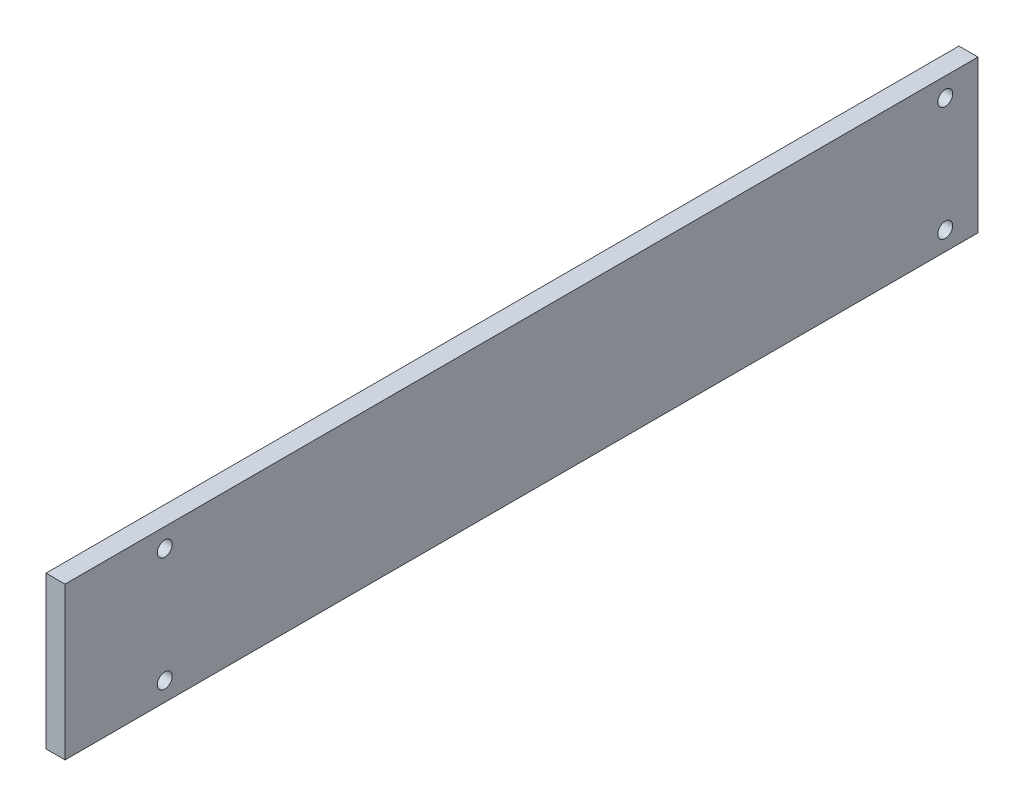
ISO-10303-21;
HEADER;
FILE_DESCRIPTION(('STEP AP214'),'2;1');
FILE_NAME('part.step','',(''),(''),'','','');
FILE_SCHEMA(('AUTOMOTIVE_DESIGN { 1 0 10303 214 1 1 1 1 }'));
ENDSEC;
DATA;
#1=APPLICATION_CONTEXT('core data for automotive mechanical design processes');
#2=APPLICATION_PROTOCOL_DEFINITION('international standard','automotive_design',2000,#1);
#3=PRODUCT_CONTEXT('',#1,'mechanical');
#4=PRODUCT('Part','Part','',(#3));
#5=PRODUCT_RELATED_PRODUCT_CATEGORY('part','',(#4));
#6=PRODUCT_DEFINITION_FORMATION('','',#4);
#7=PRODUCT_DEFINITION_CONTEXT('part definition',#1,'design');
#8=PRODUCT_DEFINITION('design','',#6,#7);
#9=PRODUCT_DEFINITION_SHAPE('','',#8);
#10=(LENGTH_UNIT() NAMED_UNIT(*) SI_UNIT(.MILLI.,.METRE.));
#11=(NAMED_UNIT(*) PLANE_ANGLE_UNIT() SI_UNIT($,.RADIAN.));
#12=(NAMED_UNIT(*) SI_UNIT($,.STERADIAN.) SOLID_ANGLE_UNIT());
#13=UNCERTAINTY_MEASURE_WITH_UNIT(LENGTH_MEASURE(1.E-05),#10,'distance_accuracy_value','');
#14=(GEOMETRIC_REPRESENTATION_CONTEXT(3) GLOBAL_UNCERTAINTY_ASSIGNED_CONTEXT((#13)) GLOBAL_UNIT_ASSIGNED_CONTEXT((#10,
#11,#12)) REPRESENTATION_CONTEXT('',''));
#15=CARTESIAN_POINT('',(0.,0.,0.));
#16=DIRECTION('',(0.,0.,1.));
#17=DIRECTION('',(1.,0.,0.));
#18=AXIS2_PLACEMENT_3D('',#15,#16,#17);
#19=CARTESIAN_POINT('',(6.35,25.4,-152.273));
#20=DIRECTION('',(0.,0.,1.));
#21=DIRECTION('',(1.,0.,0.));
#22=AXIS2_PLACEMENT_3D('',#19,#20,#21);
#23=PLANE('',#22);
#24=DIRECTION('',(0.,1.,0.));
#25=VECTOR('',#24,1.);
#26=CARTESIAN_POINT('',(0.,25.4,-152.273));
#27=LINE('',#26,#25);
#28=CARTESIAN_POINT('',(0.,-25.4,-152.273));
#29=VERTEX_POINT('',#28);
#30=CARTESIAN_POINT('',(0.,25.4,-152.273));
#31=VERTEX_POINT('',#30);
#32=EDGE_CURVE('E111',#29,#31,#27,.T.);
#33=ORIENTED_EDGE('',*,*,#32,.T.);
#34=DIRECTION('',(-1.,0.,0.));
#35=VECTOR('',#34,1.);
#36=CARTESIAN_POINT('',(6.35,25.4,-152.273));
#37=LINE('',#36,#35);
#38=CARTESIAN_POINT('',(6.35,25.4,-152.273));
#39=VERTEX_POINT('',#38);
#40=EDGE_CURVE('E11',#39,#31,#37,.T.);
#41=ORIENTED_EDGE('',*,*,#40,.F.);
#42=DIRECTION('',(0.,1.,0.));
#43=VECTOR('',#42,1.);
#44=CARTESIAN_POINT('',(6.35,25.4,-152.273));
#45=LINE('',#44,#43);
#46=CARTESIAN_POINT('',(6.35,-25.4,-152.273));
#47=VERTEX_POINT('',#46);
#48=EDGE_CURVE('E95',#47,#39,#45,.T.);
#49=ORIENTED_EDGE('',*,*,#48,.F.);
#50=DIRECTION('',(-1.,0.,0.));
#51=VECTOR('',#50,1.);
#52=CARTESIAN_POINT('',(6.35,-25.4,-152.273));
#53=LINE('',#52,#51);
#54=EDGE_CURVE('E107',#47,#29,#53,.T.);
#55=ORIENTED_EDGE('',*,*,#54,.T.);
#56=EDGE_LOOP('',(#33,#41,#49,#55));
#57=FACE_BOUND('',#56,.T.);
#58=ADVANCED_FACE('F43',(#57),#23,.F.);
#59=CARTESIAN_POINT('',(6.35,25.4,152.273));
#60=DIRECTION('',(0.,-1.,0.));
#61=DIRECTION('',(0.,0.,-1.));
#62=AXIS2_PLACEMENT_3D('',#59,#60,#61);
#63=PLANE('',#62);
#64=DIRECTION('',(0.,0.,1.));
#65=VECTOR('',#64,1.);
#66=CARTESIAN_POINT('',(0.,25.4,152.273));
#67=LINE('',#66,#65);
#68=CARTESIAN_POINT('',(0.,25.4,152.273));
#69=VERTEX_POINT('',#68);
#70=EDGE_CURVE('E100',#31,#69,#67,.T.);
#71=ORIENTED_EDGE('',*,*,#70,.T.);
#72=DIRECTION('',(-1.,0.,0.));
#73=VECTOR('',#72,1.);
#74=CARTESIAN_POINT('',(6.35,25.4,152.273));
#75=LINE('',#74,#73);
#76=CARTESIAN_POINT('',(6.35,25.4,152.273));
#77=VERTEX_POINT('',#76);
#78=EDGE_CURVE('E52',#77,#69,#75,.T.);
#79=ORIENTED_EDGE('',*,*,#78,.F.);
#80=DIRECTION('',(0.,0.,1.));
#81=VECTOR('',#80,1.);
#82=CARTESIAN_POINT('',(6.35,25.4,152.273));
#83=LINE('',#82,#81);
#84=EDGE_CURVE('E90',#39,#77,#83,.T.);
#85=ORIENTED_EDGE('',*,*,#84,.F.);
#86=ORIENTED_EDGE('',*,*,#40,.T.);
#87=EDGE_LOOP('',(#71,#79,#85,#86));
#88=FACE_BOUND('',#87,.T.);
#89=ADVANCED_FACE('F99',(#88),#63,.F.);
#90=CARTESIAN_POINT('',(6.35,25.4,152.273));
#91=DIRECTION('',(0.,0.,-1.));
#92=DIRECTION('',(-1.,0.,0.));
#93=AXIS2_PLACEMENT_3D('',#90,#91,#92);
#94=PLANE('',#93);
#95=DIRECTION('',(0.,-1.,0.));
#96=VECTOR('',#95,1.);
#97=CARTESIAN_POINT('',(0.,25.4,152.273));
#98=LINE('',#97,#96);
#99=CARTESIAN_POINT('',(0.,-25.4,152.273));
#100=VERTEX_POINT('',#99);
#101=EDGE_CURVE('E77',#69,#100,#98,.T.);
#102=ORIENTED_EDGE('',*,*,#101,.T.);
#103=DIRECTION('',(-1.,0.,0.));
#104=VECTOR('',#103,1.);
#105=CARTESIAN_POINT('',(6.35,-25.4,152.273));
#106=LINE('',#105,#104);
#107=CARTESIAN_POINT('',(6.35,-25.4,152.273));
#108=VERTEX_POINT('',#107);
#109=EDGE_CURVE('E102',#108,#100,#106,.T.);
#110=ORIENTED_EDGE('',*,*,#109,.F.);
#111=DIRECTION('',(0.,-1.,0.));
#112=VECTOR('',#111,1.);
#113=CARTESIAN_POINT('',(6.35,25.4,152.273));
#114=LINE('',#113,#112);
#115=EDGE_CURVE('E93',#77,#108,#114,.T.);
#116=ORIENTED_EDGE('',*,*,#115,.F.);
#117=ORIENTED_EDGE('',*,*,#78,.T.);
#118=EDGE_LOOP('',(#102,#110,#116,#117));
#119=FACE_BOUND('',#118,.T.);
#120=ADVANCED_FACE('F103',(#119),#94,.F.);
#121=CARTESIAN_POINT('',(6.35,-25.4,152.273));
#122=DIRECTION('',(0.,1.,0.));
#123=DIRECTION('',(0.,0.,1.));
#124=AXIS2_PLACEMENT_3D('',#121,#122,#123);
#125=PLANE('',#124);
#126=DIRECTION('',(0.,0.,-1.));
#127=VECTOR('',#126,1.);
#128=CARTESIAN_POINT('',(0.,-25.4,152.273));
#129=LINE('',#128,#127);
#130=EDGE_CURVE('E83',#100,#29,#129,.T.);
#131=ORIENTED_EDGE('',*,*,#130,.T.);
#132=ORIENTED_EDGE('',*,*,#54,.F.);
#133=DIRECTION('',(0.,0.,-1.));
#134=VECTOR('',#133,1.);
#135=CARTESIAN_POINT('',(6.35,-25.4,152.273));
#136=LINE('',#135,#134);
#137=EDGE_CURVE('E60',#108,#47,#136,.T.);
#138=ORIENTED_EDGE('',*,*,#137,.F.);
#139=ORIENTED_EDGE('',*,*,#109,.T.);
#140=EDGE_LOOP('',(#131,#132,#138,#139));
#141=FACE_BOUND('',#140,.T.);
#142=ADVANCED_FACE('F125',(#141),#125,.F.);
#143=CARTESIAN_POINT('',(6.35,0.,0.));
#144=DIRECTION('',(1.,0.,0.));
#145=DIRECTION('',(0.,0.,-1.));
#146=AXIS2_PLACEMENT_3D('',#143,#144,#145);
#147=PLANE('',#146);
#148=CARTESIAN_POINT('',(6.35,19.05,118.999));
#149=DIRECTION('',(1.,0.,0.));
#150=DIRECTION('',(0.,0.,-1.));
#151=AXIS2_PLACEMENT_3D('',#148,#149,#150);
#152=CIRCLE('',#151,2.48919999999999);
#153=CARTESIAN_POINT('',(6.35,19.05,116.5098));
#154=VERTEX_POINT('',#153);
#155=EDGE_CURVE('E159',#154,#154,#152,.T.);
#156=ORIENTED_EDGE('',*,*,#155,.F.);
#157=EDGE_LOOP('',(#156));
#158=FACE_BOUND('',#157,.T.);
#159=CARTESIAN_POINT('',(6.35,-19.05,118.999));
#160=DIRECTION('',(1.,0.,0.));
#161=DIRECTION('',(0.,0.,-1.));
#162=AXIS2_PLACEMENT_3D('',#159,#160,#161);
#163=CIRCLE('',#162,2.48919999999999);
#164=CARTESIAN_POINT('',(6.35,-19.05,116.5098));
#165=VERTEX_POINT('',#164);
#166=EDGE_CURVE('E151',#165,#165,#163,.T.);
#167=ORIENTED_EDGE('',*,*,#166,.F.);
#168=EDGE_LOOP('',(#167));
#169=FACE_BOUND('',#168,.T.);
#170=CARTESIAN_POINT('',(6.35,-19.05,-141.351));
#171=DIRECTION('',(1.,0.,0.));
#172=DIRECTION('',(0.,0.,-1.));
#173=AXIS2_PLACEMENT_3D('',#170,#171,#172);
#174=CIRCLE('',#173,2.48919999999999);
#175=CARTESIAN_POINT('',(6.35,-19.05,-143.8402));
#176=VERTEX_POINT('',#175);
#177=EDGE_CURVE('E143',#176,#176,#174,.T.);
#178=ORIENTED_EDGE('',*,*,#177,.F.);
#179=EDGE_LOOP('',(#178));
#180=FACE_BOUND('',#179,.T.);
#181=CARTESIAN_POINT('',(6.35,19.05,-141.351));
#182=DIRECTION('',(1.,0.,0.));
#183=DIRECTION('',(0.,0.,-1.));
#184=AXIS2_PLACEMENT_3D('',#181,#182,#183);
#185=CIRCLE('',#184,2.48919999999999);
#186=CARTESIAN_POINT('',(6.35,19.05,-143.8402));
#187=VERTEX_POINT('',#186);
#188=EDGE_CURVE('E135',#187,#187,#185,.T.);
#189=ORIENTED_EDGE('',*,*,#188,.F.);
#190=EDGE_LOOP('',(#189));
#191=FACE_BOUND('',#190,.T.);
#192=ORIENTED_EDGE('',*,*,#48,.T.);
#193=ORIENTED_EDGE('',*,*,#84,.T.);
#194=ORIENTED_EDGE('',*,*,#115,.T.);
#195=ORIENTED_EDGE('',*,*,#137,.T.);
#196=EDGE_LOOP('',(#192,#193,#194,#195));
#197=FACE_BOUND('',#196,.T.);
#198=ADVANCED_FACE('F91',(#158,#169,#180,#191,#197),#147,.T.);
#199=CARTESIAN_POINT('',(0.,0.,0.));
#200=DIRECTION('',(1.,0.,0.));
#201=DIRECTION('',(0.,0.,-1.));
#202=AXIS2_PLACEMENT_3D('',#199,#200,#201);
#203=PLANE('',#202);
#204=CARTESIAN_POINT('',(0.,19.05,118.999));
#205=DIRECTION('',(1.,0.,0.));
#206=DIRECTION('',(0.,0.,-1.));
#207=AXIS2_PLACEMENT_3D('',#204,#205,#206);
#208=CIRCLE('',#207,2.48919999999999);
#209=CARTESIAN_POINT('',(0.,19.05,116.5098));
#210=VERTEX_POINT('',#209);
#211=EDGE_CURVE('E155',#210,#210,#208,.T.);
#212=ORIENTED_EDGE('',*,*,#211,.T.);
#213=EDGE_LOOP('',(#212));
#214=FACE_BOUND('',#213,.T.);
#215=CARTESIAN_POINT('',(0.,-19.05,118.999));
#216=DIRECTION('',(1.,0.,0.));
#217=DIRECTION('',(0.,0.,-1.));
#218=AXIS2_PLACEMENT_3D('',#215,#216,#217);
#219=CIRCLE('',#218,2.48919999999999);
#220=CARTESIAN_POINT('',(0.,-19.05,116.5098));
#221=VERTEX_POINT('',#220);
#222=EDGE_CURVE('E147',#221,#221,#219,.T.);
#223=ORIENTED_EDGE('',*,*,#222,.T.);
#224=EDGE_LOOP('',(#223));
#225=FACE_BOUND('',#224,.T.);
#226=CARTESIAN_POINT('',(0.,-19.05,-141.351));
#227=DIRECTION('',(1.,0.,0.));
#228=DIRECTION('',(0.,0.,-1.));
#229=AXIS2_PLACEMENT_3D('',#226,#227,#228);
#230=CIRCLE('',#229,2.48919999999999);
#231=CARTESIAN_POINT('',(0.,-19.05,-143.8402));
#232=VERTEX_POINT('',#231);
#233=EDGE_CURVE('E139',#232,#232,#230,.T.);
#234=ORIENTED_EDGE('',*,*,#233,.T.);
#235=EDGE_LOOP('',(#234));
#236=FACE_BOUND('',#235,.T.);
#237=CARTESIAN_POINT('',(0.,19.05,-141.351));
#238=DIRECTION('',(1.,0.,0.));
#239=DIRECTION('',(0.,0.,-1.));
#240=AXIS2_PLACEMENT_3D('',#237,#238,#239);
#241=CIRCLE('',#240,2.48919999999999);
#242=CARTESIAN_POINT('',(0.,19.05,-143.8402));
#243=VERTEX_POINT('',#242);
#244=EDGE_CURVE('E115',#243,#243,#241,.T.);
#245=ORIENTED_EDGE('',*,*,#244,.T.);
#246=EDGE_LOOP('',(#245));
#247=FACE_BOUND('',#246,.T.);
#248=ORIENTED_EDGE('',*,*,#32,.F.);
#249=ORIENTED_EDGE('',*,*,#130,.F.);
#250=ORIENTED_EDGE('',*,*,#101,.F.);
#251=ORIENTED_EDGE('',*,*,#70,.F.);
#252=EDGE_LOOP('',(#248,#249,#250,#251));
#253=FACE_BOUND('',#252,.T.);
#254=ADVANCED_FACE('F128',(#214,#225,#236,#247,#253),#203,.F.);
#255=CARTESIAN_POINT('',(6.35,19.05,-141.351));
#256=DIRECTION('',(1.,0.,0.));
#257=DIRECTION('',(0.,0.,-1.));
#258=AXIS2_PLACEMENT_3D('',#255,#256,#257);
#259=CYLINDRICAL_SURFACE('',#258,2.48919999999999);
#260=ORIENTED_EDGE('',*,*,#244,.F.);
#261=EDGE_LOOP('',(#260));
#262=FACE_BOUND('',#261,.T.);
#263=ORIENTED_EDGE('',*,*,#188,.T.);
#264=EDGE_LOOP('',(#263));
#265=FACE_BOUND('',#264,.T.);
#266=ADVANCED_FACE('F175',(#262,#265),#259,.F.);
#267=CARTESIAN_POINT('',(6.35,-19.05,-141.351));
#268=DIRECTION('',(1.,0.,0.));
#269=DIRECTION('',(0.,0.,-1.));
#270=AXIS2_PLACEMENT_3D('',#267,#268,#269);
#271=CYLINDRICAL_SURFACE('',#270,2.48919999999999);
#272=ORIENTED_EDGE('',*,*,#233,.F.);
#273=EDGE_LOOP('',(#272));
#274=FACE_BOUND('',#273,.T.);
#275=ORIENTED_EDGE('',*,*,#177,.T.);
#276=EDGE_LOOP('',(#275));
#277=FACE_BOUND('',#276,.T.);
#278=ADVANCED_FACE('F177',(#274,#277),#271,.F.);
#279=CARTESIAN_POINT('',(6.35,-19.05,118.999));
#280=DIRECTION('',(1.,0.,0.));
#281=DIRECTION('',(0.,0.,-1.));
#282=AXIS2_PLACEMENT_3D('',#279,#280,#281);
#283=CYLINDRICAL_SURFACE('',#282,2.48919999999999);
#284=ORIENTED_EDGE('',*,*,#222,.F.);
#285=EDGE_LOOP('',(#284));
#286=FACE_BOUND('',#285,.T.);
#287=ORIENTED_EDGE('',*,*,#166,.T.);
#288=EDGE_LOOP('',(#287));
#289=FACE_BOUND('',#288,.T.);
#290=ADVANCED_FACE('F184',(#286,#289),#283,.F.);
#291=CARTESIAN_POINT('',(6.35,19.05,118.999));
#292=DIRECTION('',(1.,0.,0.));
#293=DIRECTION('',(0.,0.,-1.));
#294=AXIS2_PLACEMENT_3D('',#291,#292,#293);
#295=CYLINDRICAL_SURFACE('',#294,2.48919999999999);
#296=ORIENTED_EDGE('',*,*,#211,.F.);
#297=EDGE_LOOP('',(#296));
#298=FACE_BOUND('',#297,.T.);
#299=ORIENTED_EDGE('',*,*,#155,.T.);
#300=EDGE_LOOP('',(#299));
#301=FACE_BOUND('',#300,.T.);
#302=ADVANCED_FACE('F164',(#298,#301),#295,.F.);
#303=CLOSED_SHELL('',(#58,#89,#120,#142,#198,#254,#266,#278,#290,#302));
#304=MANIFOLD_SOLID_BREP('B2',#303);
#305=ADVANCED_BREP_SHAPE_REPRESENTATION('',(#18,#304),#14);
#306=SHAPE_DEFINITION_REPRESENTATION(#9,#305);
ENDSEC;
END-ISO-10303-21;
